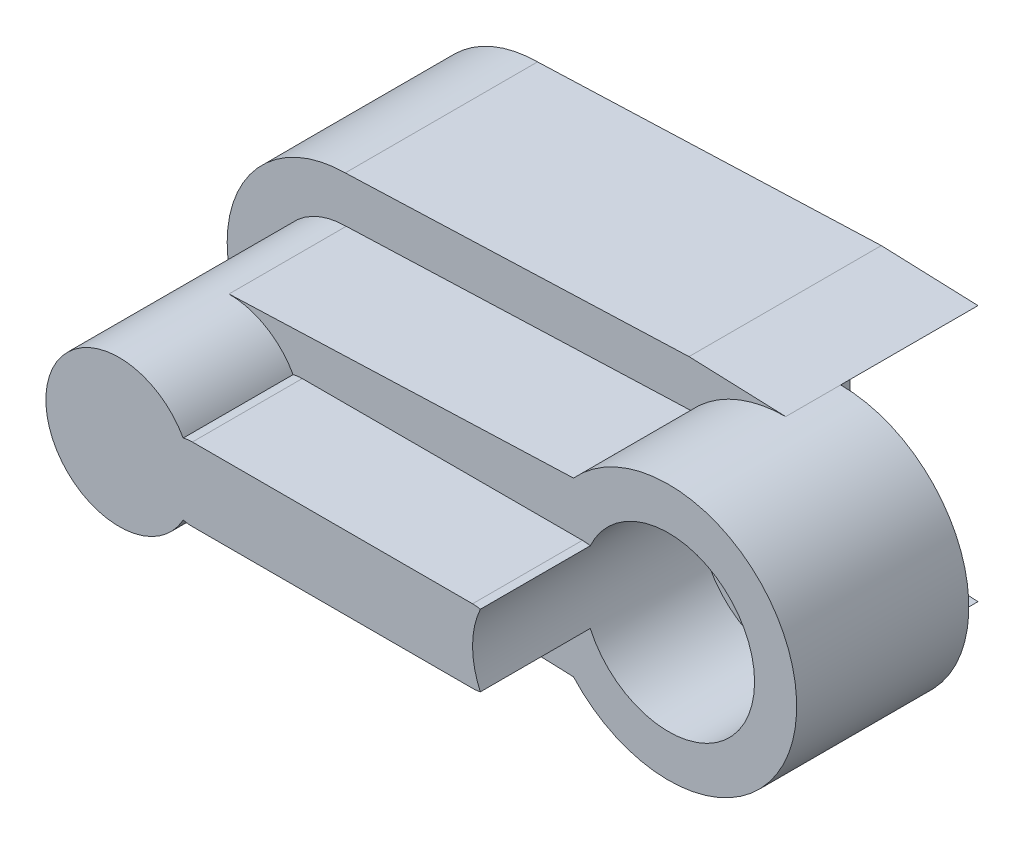
ISO-10303-21;
HEADER;
FILE_DESCRIPTION(('STEP AP214'),'2;1');
FILE_NAME('part.step','',(''),(''),'','','');
FILE_SCHEMA(('AUTOMOTIVE_DESIGN { 1 0 10303 214 1 1 1 1 }'));
ENDSEC;
DATA;
#1=APPLICATION_CONTEXT('core data for automotive mechanical design processes');
#2=APPLICATION_PROTOCOL_DEFINITION('international standard','automotive_design',2000,#1);
#3=PRODUCT_CONTEXT('',#1,'mechanical');
#4=PRODUCT('Part','Part','',(#3));
#5=PRODUCT_RELATED_PRODUCT_CATEGORY('part','',(#4));
#6=PRODUCT_DEFINITION_FORMATION('','',#4);
#7=PRODUCT_DEFINITION_CONTEXT('part definition',#1,'design');
#8=PRODUCT_DEFINITION('design','',#6,#7);
#9=PRODUCT_DEFINITION_SHAPE('','',#8);
#10=(LENGTH_UNIT() NAMED_UNIT(*) SI_UNIT(.MILLI.,.METRE.));
#11=(NAMED_UNIT(*) PLANE_ANGLE_UNIT() SI_UNIT($,.RADIAN.));
#12=(NAMED_UNIT(*) SI_UNIT($,.STERADIAN.) SOLID_ANGLE_UNIT());
#13=UNCERTAINTY_MEASURE_WITH_UNIT(LENGTH_MEASURE(1.E-05),#10,'distance_accuracy_value','');
#14=(GEOMETRIC_REPRESENTATION_CONTEXT(3) GLOBAL_UNCERTAINTY_ASSIGNED_CONTEXT((#13)) GLOBAL_UNIT_ASSIGNED_CONTEXT((#10,
#11,#12)) REPRESENTATION_CONTEXT('',''));
#15=CARTESIAN_POINT('',(0.,0.,0.));
#16=DIRECTION('',(0.,0.,1.));
#17=DIRECTION('',(1.,0.,0.));
#18=AXIS2_PLACEMENT_3D('',#15,#16,#17);
#19=CARTESIAN_POINT('',(-10.9395179752261,0.,2.));
#20=DIRECTION('',(0.,0.,-1.));
#21=DIRECTION('',(-1.,0.,0.));
#22=AXIS2_PLACEMENT_3D('',#19,#20,#21);
#23=PLANE('',#22);
#24=CARTESIAN_POINT('',(1.06048202477386,0.,2.));
#25=DIRECTION('',(0.,0.,-1.));
#26=DIRECTION('',(-1.,0.,0.));
#27=AXIS2_PLACEMENT_3D('',#24,#25,#26);
#28=CIRCLE('',#27,3.5);
#29=CARTESIAN_POINT('',(-0.867701970224191,2.92097697379376,2.));
#30=VERTEX_POINT('',#29);
#31=CARTESIAN_POINT('',(1.06048202477389,3.5,2.));
#32=VERTEX_POINT('',#31);
#33=EDGE_CURVE('E260',#30,#32,#28,.T.);
#34=ORIENTED_EDGE('',*,*,#33,.T.);
#35=CARTESIAN_POINT('',(1.06048202477386,0.,2.));
#36=DIRECTION('',(0.,0.,-1.));
#37=DIRECTION('',(-1.,0.,0.));
#38=AXIS2_PLACEMENT_3D('',#35,#36,#37);
#39=CIRCLE('',#38,3.5);
#40=CARTESIAN_POINT('',(1.06048202477382,-3.5,2.));
#41=VERTEX_POINT('',#40);
#42=EDGE_CURVE('E328',#32,#41,#39,.T.);
#43=ORIENTED_EDGE('',*,*,#42,.T.);
#44=CARTESIAN_POINT('',(1.06048202477386,0.,2.));
#45=DIRECTION('',(0.,0.,-1.));
#46=DIRECTION('',(-1.,0.,0.));
#47=AXIS2_PLACEMENT_3D('',#44,#45,#46);
#48=CIRCLE('',#47,3.5);
#49=CARTESIAN_POINT('',(-0.867701970224192,-2.92097697379376,2.));
#50=VERTEX_POINT('',#49);
#51=EDGE_CURVE('E215',#41,#50,#48,.T.);
#52=ORIENTED_EDGE('',*,*,#51,.T.);
#53=DIRECTION('',(0.998709726836808,-0.0507826891917705,0.));
#54=VECTOR('',#53,1.);
#55=CARTESIAN_POINT('',(-0.150381373619152,-2.95745150481052,2.));
#56=LINE('',#55,#54);
#57=CARTESIAN_POINT('',(-13.2440324405478,-2.29166164150024,2.));
#58=VERTEX_POINT('',#57);
#59=EDGE_CURVE('E276',#58,#50,#56,.T.);
#60=ORIENTED_EDGE('',*,*,#59,.F.);
#61=CARTESIAN_POINT('',(-10.9395179752261,0.,2.));
#62=DIRECTION('',(0.,0.,-1.));
#63=DIRECTION('',(-1.,0.,0.));
#64=AXIS2_PLACEMENT_3D('',#61,#62,#63);
#65=CIRCLE('',#64,3.24999999999999);
#66=CARTESIAN_POINT('',(-13.2440324405476,2.29166164150025,2.));
#67=VERTEX_POINT('',#66);
#68=EDGE_CURVE('E67',#58,#67,#65,.T.);
#69=ORIENTED_EDGE('',*,*,#68,.T.);
#70=DIRECTION('',(0.998709726836808,0.0507826891917705,0.));
#71=VECTOR('',#70,1.);
#72=CARTESIAN_POINT('',(-0.150381373619152,2.95745150481052,2.));
#73=LINE('',#72,#71);
#74=EDGE_CURVE('E62',#67,#30,#73,.T.);
#75=ORIENTED_EDGE('',*,*,#74,.T.);
#76=EDGE_LOOP('',(#34,#43,#52,#60,#69,#75));
#77=FACE_BOUND('',#76,.T.);
#78=CARTESIAN_POINT('',(1.06048202477387,0.,2.));
#79=DIRECTION('',(0.,0.,-1.));
#80=DIRECTION('',(-1.,0.,0.));
#81=AXIS2_PLACEMENT_3D('',#78,#79,#80);
#82=CIRCLE('',#81,1.45);
#83=CARTESIAN_POINT('',(-0.389517975226135,0.,2.));
#84=VERTEX_POINT('',#83);
#85=EDGE_CURVE('E310',#84,#84,#82,.T.);
#86=ORIENTED_EDGE('',*,*,#85,.F.);
#87=EDGE_LOOP('',(#86));
#88=FACE_BOUND('',#87,.T.);
#89=ADVANCED_FACE('F45',(#77,#88),#23,.T.);
#90=CARTESIAN_POINT('',(-0.089440802020708,2.40372347859468,6.7));
#91=DIRECTION('',(-0.0371835405784303,0.999308453036425,0.));
#92=DIRECTION('',(-0.999308453036425,-0.0371835405784303,0.));
#93=AXIS2_PLACEMENT_3D('',#90,#91,#92);
#94=PLANE('',#93);
#95=DIRECTION('',(0.,0.,-1.));
#96=VECTOR('',#95,1.);
#97=CARTESIAN_POINT('',(-1.53326044509472,2.35000000000001,6.7));
#98=LINE('',#97,#96);
#99=CARTESIAN_POINT('',(-1.53326044509472,2.35000000000001,6.7));
#100=VERTEX_POINT('',#99);
#101=CARTESIAN_POINT('',(-1.53326044509472,2.35000000000001,3.5));
#102=VERTEX_POINT('',#101);
#103=EDGE_CURVE('E401',#100,#102,#98,.T.);
#104=ORIENTED_EDGE('',*,*,#103,.T.);
#105=DIRECTION('',(0.999308453036425,0.0371835405784326,0.));
#106=VECTOR('',#105,1.);
#107=CARTESIAN_POINT('',(-0.0894408020207136,2.40372347859468,3.5));
#108=LINE('',#107,#106);
#109=CARTESIAN_POINT('',(-10.9395179752261,1.99999999999993,3.5));
#110=VERTEX_POINT('',#109);
#111=EDGE_CURVE('E294',#110,#102,#108,.T.);
#112=ORIENTED_EDGE('',*,*,#111,.F.);
#113=DIRECTION('',(0.,0.,-1.));
#114=VECTOR('',#113,1.);
#115=CARTESIAN_POINT('',(-10.9395179752261,1.99999999999993,6.7));
#116=LINE('',#115,#114);
#117=CARTESIAN_POINT('',(-10.9395179752261,1.99999999999993,6.7));
#118=VERTEX_POINT('',#117);
#119=EDGE_CURVE('E49',#118,#110,#116,.T.);
#120=ORIENTED_EDGE('',*,*,#119,.F.);
#121=DIRECTION('',(0.999308453036425,0.0371835405784303,0.));
#122=VECTOR('',#121,1.);
#123=CARTESIAN_POINT('',(-0.089440802020708,2.40372347859468,6.7));
#124=LINE('',#123,#122);
#125=EDGE_CURVE('E391',#118,#100,#124,.T.);
#126=ORIENTED_EDGE('',*,*,#125,.T.);
#127=EDGE_LOOP('',(#104,#112,#120,#126));
#128=FACE_BOUND('',#127,.T.);
#129=ADVANCED_FACE('F47',(#128),#94,.T.);
#130=CARTESIAN_POINT('',(-10.9395179752261,0.,6.7));
#131=DIRECTION('',(0.,0.,-1.));
#132=DIRECTION('',(-1.,0.,0.));
#133=AXIS2_PLACEMENT_3D('',#130,#131,#132);
#134=CYLINDRICAL_SURFACE('',#133,2.);
#135=CARTESIAN_POINT('',(-10.9395179752261,0.,3.5));
#136=DIRECTION('',(0.,0.,-1.));
#137=DIRECTION('',(-1.,0.,0.));
#138=AXIS2_PLACEMENT_3D('',#135,#136,#137);
#139=CIRCLE('',#138,1.99999999999999);
#140=CARTESIAN_POINT('',(-10.9395179752261,-2.00000000000005,3.5));
#141=VERTEX_POINT('',#140);
#142=EDGE_CURVE('E297',#141,#110,#139,.T.);
#143=ORIENTED_EDGE('',*,*,#142,.F.);
#144=DIRECTION('',(0.,0.,-1.));
#145=VECTOR('',#144,1.);
#146=CARTESIAN_POINT('',(-10.9395179752261,-2.00000000000005,6.7));
#147=LINE('',#146,#145);
#148=CARTESIAN_POINT('',(-10.9395179752261,-2.00000000000005,6.7));
#149=VERTEX_POINT('',#148);
#150=EDGE_CURVE('E406',#149,#141,#147,.T.);
#151=ORIENTED_EDGE('',*,*,#150,.F.);
#152=CARTESIAN_POINT('',(-10.9395179752261,0.,6.7));
#153=DIRECTION('',(0.,0.,1.));
#154=DIRECTION('',(1.,0.,0.));
#155=AXIS2_PLACEMENT_3D('',#152,#153,#154);
#156=CIRCLE('',#155,2.);
#157=CARTESIAN_POINT('',(-9.18951797522613,-0.968245836551952,6.7));
#158=VERTEX_POINT('',#157);
#159=EDGE_CURVE('E11',#149,#158,#156,.T.);
#160=ORIENTED_EDGE('',*,*,#159,.T.);
#161=DIRECTION('',(0.,0.,-1.));
#162=VECTOR('',#161,1.);
#163=CARTESIAN_POINT('',(-9.18951797522613,-0.968245836551952,9.7));
#164=LINE('',#163,#162);
#165=CARTESIAN_POINT('',(-9.18951797522613,-0.968245836551952,9.7));
#166=VERTEX_POINT('',#165);
#167=EDGE_CURVE('E385',#166,#158,#164,.T.);
#168=ORIENTED_EDGE('',*,*,#167,.F.);
#169=CARTESIAN_POINT('',(-10.9395179752261,0.,9.7));
#170=DIRECTION('',(0.,0.,1.));
#171=DIRECTION('',(1.,0.,0.));
#172=AXIS2_PLACEMENT_3D('',#169,#170,#171);
#173=CIRCLE('',#172,2.);
#174=CARTESIAN_POINT('',(-9.18951797522623,0.968245836551927,9.7));
#175=VERTEX_POINT('',#174);
#176=EDGE_CURVE('E335',#175,#166,#173,.T.);
#177=ORIENTED_EDGE('',*,*,#176,.F.);
#178=DIRECTION('',(0.,0.,-1.));
#179=VECTOR('',#178,1.);
#180=CARTESIAN_POINT('',(-9.18951797522623,0.968245836551927,9.7));
#181=LINE('',#180,#179);
#182=CARTESIAN_POINT('',(-9.18951797522623,0.968245836551927,6.7));
#183=VERTEX_POINT('',#182);
#184=EDGE_CURVE('E388',#175,#183,#181,.T.);
#185=ORIENTED_EDGE('',*,*,#184,.T.);
#186=EDGE_CURVE('E55',#183,#118,#156,.T.);
#187=ORIENTED_EDGE('',*,*,#186,.T.);
#188=ORIENTED_EDGE('',*,*,#119,.T.);
#189=EDGE_LOOP('',(#143,#151,#160,#168,#177,#185,#187,#188));
#190=FACE_BOUND('',#189,.T.);
#191=ADVANCED_FACE('F415',(#190),#134,.T.);
#192=CARTESIAN_POINT('',(-0.0894408020206935,-2.40372347859467,6.7));
#193=DIRECTION('',(0.0371835405784244,0.999308453036425,0.));
#194=DIRECTION('',(-0.999308453036425,0.0371835405784244,0.));
#195=AXIS2_PLACEMENT_3D('',#192,#193,#194);
#196=PLANE('',#195);
#197=DIRECTION('',(-0.999308453036425,0.0371835405784195,0.));
#198=VECTOR('',#197,1.);
#199=CARTESIAN_POINT('',(-0.0894408020206816,-2.40372347859467,3.5));
#200=LINE('',#199,#198);
#201=CARTESIAN_POINT('',(-1.53326044509472,-2.35000000000001,3.5));
#202=VERTEX_POINT('',#201);
#203=EDGE_CURVE('E299',#202,#141,#200,.T.);
#204=ORIENTED_EDGE('',*,*,#203,.F.);
#205=DIRECTION('',(0.,0.,-1.));
#206=VECTOR('',#205,1.);
#207=CARTESIAN_POINT('',(-1.53326044509472,-2.35000000000001,6.7));
#208=LINE('',#207,#206);
#209=CARTESIAN_POINT('',(-1.53326044509472,-2.35000000000001,6.7));
#210=VERTEX_POINT('',#209);
#211=EDGE_CURVE('E404',#210,#202,#208,.T.);
#212=ORIENTED_EDGE('',*,*,#211,.F.);
#213=DIRECTION('',(0.999308453036425,-0.0371835405784244,0.));
#214=VECTOR('',#213,1.);
#215=CARTESIAN_POINT('',(-0.0894408020206935,-2.40372347859467,6.7));
#216=LINE('',#215,#214);
#217=EDGE_CURVE('E394',#149,#210,#216,.T.);
#218=ORIENTED_EDGE('',*,*,#217,.F.);
#219=ORIENTED_EDGE('',*,*,#150,.T.);
#220=EDGE_LOOP('',(#204,#212,#218,#219));
#221=FACE_BOUND('',#220,.T.);
#222=ADVANCED_FACE('F448',(#221),#196,.F.);
#223=CARTESIAN_POINT('',(1.06048202477386,0.,6.7));
#224=DIRECTION('',(0.,0.,-1.));
#225=DIRECTION('',(-1.,0.,0.));
#226=AXIS2_PLACEMENT_3D('',#223,#224,#225);
#227=CYLINDRICAL_SURFACE('',#226,3.5);
#228=ORIENTED_EDGE('',*,*,#42,.F.);
#229=DIRECTION('',(0.,0.,-1.));
#230=VECTOR('',#229,1.);
#231=CARTESIAN_POINT('',(1.06048202477389,3.5,3.5));
#232=LINE('',#231,#230);
#233=CARTESIAN_POINT('',(1.06048202477389,3.5,3.5));
#234=VERTEX_POINT('',#233);
#235=EDGE_CURVE('E314',#234,#32,#232,.T.);
#236=ORIENTED_EDGE('',*,*,#235,.F.);
#237=CARTESIAN_POINT('',(1.06048202477386,0.,3.5));
#238=DIRECTION('',(0.,0.,-1.));
#239=DIRECTION('',(-1.,0.,0.));
#240=AXIS2_PLACEMENT_3D('',#237,#238,#239);
#241=CIRCLE('',#240,3.5);
#242=EDGE_CURVE('E292',#102,#234,#241,.T.);
#243=ORIENTED_EDGE('',*,*,#242,.F.);
#244=ORIENTED_EDGE('',*,*,#103,.F.);
#245=CARTESIAN_POINT('',(1.06048202477386,0.,6.7));
#246=DIRECTION('',(0.,0.,1.));
#247=DIRECTION('',(1.,0.,0.));
#248=AXIS2_PLACEMENT_3D('',#245,#246,#247);
#249=CIRCLE('',#248,3.5);
#250=EDGE_CURVE('E396',#210,#100,#249,.T.);
#251=ORIENTED_EDGE('',*,*,#250,.F.);
#252=ORIENTED_EDGE('',*,*,#211,.T.);
#253=CARTESIAN_POINT('',(1.06048202477382,-3.5,3.5));
#254=VERTEX_POINT('',#253);
#255=EDGE_CURVE('E295',#254,#202,#241,.T.);
#256=ORIENTED_EDGE('',*,*,#255,.F.);
#257=DIRECTION('',(0.,0.,-1.));
#258=VECTOR('',#257,1.);
#259=CARTESIAN_POINT('',(1.06048202477382,-3.5,3.5));
#260=LINE('',#259,#258);
#261=EDGE_CURVE('E312',#254,#41,#260,.T.);
#262=ORIENTED_EDGE('',*,*,#261,.T.);
#263=EDGE_LOOP('',(#228,#236,#243,#244,#251,#252,#256,#262));
#264=FACE_BOUND('',#263,.T.);
#265=ADVANCED_FACE('F427',(#264),#227,.T.);
#266=CARTESIAN_POINT('',(1.06048202477386,0.,6.7));
#267=DIRECTION('',(0.,0.,-1.));
#268=DIRECTION('',(-1.,0.,0.));
#269=AXIS2_PLACEMENT_3D('',#266,#267,#268);
#270=CYLINDRICAL_SURFACE('',#269,2.35);
#271=CARTESIAN_POINT('',(1.06048202477386,0.,6.7));
#272=DIRECTION('',(0.,0.,1.));
#273=DIRECTION('',(1.,0.,0.));
#274=AXIS2_PLACEMENT_3D('',#271,#272,#273);
#275=CIRCLE('',#274,2.35);
#276=CARTESIAN_POINT('',(-1.07675201777933,-0.977103191762131,6.7));
#277=VERTEX_POINT('',#276);
#278=CARTESIAN_POINT('',(-1.07675201777933,0.977103191762131,6.7));
#279=VERTEX_POINT('',#278);
#280=EDGE_CURVE('E398',#277,#279,#275,.T.);
#281=ORIENTED_EDGE('',*,*,#280,.T.);
#282=DIRECTION('',(0.,0.,-1.));
#283=VECTOR('',#282,1.);
#284=CARTESIAN_POINT('',(-1.07675201777933,0.977103191762131,9.7));
#285=LINE('',#284,#283);
#286=CARTESIAN_POINT('',(-1.07675201777933,0.977103191762131,9.7));
#287=VERTEX_POINT('',#286);
#288=EDGE_CURVE('E373',#287,#279,#285,.T.);
#289=ORIENTED_EDGE('',*,*,#288,.F.);
#290=CARTESIAN_POINT('',(1.06048202477386,0.,9.7));
#291=DIRECTION('',(0.,0.,-1.));
#292=DIRECTION('',(1.,0.,0.));
#293=AXIS2_PLACEMENT_3D('',#290,#291,#292);
#294=CIRCLE('',#293,2.35);
#295=CARTESIAN_POINT('',(-1.07675201777933,-0.977103191762131,9.7));
#296=VERTEX_POINT('',#295);
#297=EDGE_CURVE('E344',#296,#287,#294,.T.);
#298=ORIENTED_EDGE('',*,*,#297,.F.);
#299=DIRECTION('',(0.,0.,-1.));
#300=VECTOR('',#299,1.);
#301=CARTESIAN_POINT('',(-1.07675201777933,-0.977103191762131,9.7));
#302=LINE('',#301,#300);
#303=EDGE_CURVE('E376',#296,#277,#302,.T.);
#304=ORIENTED_EDGE('',*,*,#303,.T.);
#305=EDGE_LOOP('',(#281,#289,#298,#304));
#306=FACE_BOUND('',#305,.T.);
#307=CARTESIAN_POINT('',(1.06048202477387,0.,3.5));
#308=DIRECTION('',(0.,0.,-1.));
#309=DIRECTION('',(-1.,0.,0.));
#310=AXIS2_PLACEMENT_3D('',#307,#308,#309);
#311=CIRCLE('',#310,2.35);
#312=CARTESIAN_POINT('',(-1.28951797522614,0.,3.5));
#313=VERTEX_POINT('',#312);
#314=EDGE_CURVE('E323',#313,#313,#311,.T.);
#315=ORIENTED_EDGE('',*,*,#314,.T.);
#316=EDGE_LOOP('',(#315));
#317=FACE_BOUND('',#316,.T.);
#318=ADVANCED_FACE('F456',(#306,#317),#270,.F.);
#319=CARTESIAN_POINT('',(0.,0.,6.7));
#320=DIRECTION('',(0.,0.,1.));
#321=DIRECTION('',(1.,0.,0.));
#322=AXIS2_PLACEMENT_3D('',#319,#320,#321);
#323=PLANE('',#322);
#324=CARTESIAN_POINT('',(-1.28951797522614,0.,6.7));
#325=DIRECTION('',(0.,0.,1.));
#326=DIRECTION('',(1.,0.,0.));
#327=AXIS2_PLACEMENT_3D('',#324,#325,#326);
#328=CIRCLE('',#327,1.);
#329=CARTESIAN_POINT('',(-1.28951797522614,1.,6.7));
#330=VERTEX_POINT('',#329);
#331=EDGE_CURVE('E363',#279,#330,#328,.T.);
#332=ORIENTED_EDGE('',*,*,#331,.F.);
#333=ORIENTED_EDGE('',*,*,#280,.F.);
#334=CARTESIAN_POINT('',(-1.28951797522614,0.,6.7));
#335=DIRECTION('',(0.,0.,1.));
#336=DIRECTION('',(1.,0.,0.));
#337=AXIS2_PLACEMENT_3D('',#334,#335,#336);
#338=CIRCLE('',#337,1.);
#339=CARTESIAN_POINT('',(-1.28951797522614,-1.,6.7));
#340=VERTEX_POINT('',#339);
#341=EDGE_CURVE('E360',#340,#277,#338,.T.);
#342=ORIENTED_EDGE('',*,*,#341,.F.);
#343=DIRECTION('',(1.,0.,0.));
#344=VECTOR('',#343,1.);
#345=CARTESIAN_POINT('',(-8.93951797522613,-1.,6.7));
#346=LINE('',#345,#344);
#347=CARTESIAN_POINT('',(-8.93951797522613,-1.00000000000005,6.7));
#348=VERTEX_POINT('',#347);
#349=EDGE_CURVE('E357',#348,#340,#346,.T.);
#350=ORIENTED_EDGE('',*,*,#349,.F.);
#351=CARTESIAN_POINT('',(-8.93951797522613,0.,6.7));
#352=DIRECTION('',(0.,0.,1.));
#353=DIRECTION('',(1.,0.,0.));
#354=AXIS2_PLACEMENT_3D('',#351,#352,#353);
#355=CIRCLE('',#354,0.999999999999952);
#356=EDGE_CURVE('E354',#158,#348,#355,.T.);
#357=ORIENTED_EDGE('',*,*,#356,.F.);
#358=ORIENTED_EDGE('',*,*,#159,.F.);
#359=ORIENTED_EDGE('',*,*,#217,.T.);
#360=ORIENTED_EDGE('',*,*,#250,.T.);
#361=ORIENTED_EDGE('',*,*,#125,.F.);
#362=ORIENTED_EDGE('',*,*,#186,.F.);
#363=CARTESIAN_POINT('',(-8.93951797522613,0.,6.7));
#364=DIRECTION('',(0.,0.,1.));
#365=DIRECTION('',(1.,0.,0.));
#366=AXIS2_PLACEMENT_3D('',#363,#364,#365);
#367=CIRCLE('',#366,1.00000000000014);
#368=CARTESIAN_POINT('',(-8.93951797522613,1.,6.7));
#369=VERTEX_POINT('',#368);
#370=EDGE_CURVE('E331',#369,#183,#367,.T.);
#371=ORIENTED_EDGE('',*,*,#370,.F.);
#372=DIRECTION('',(-1.,0.,0.));
#373=VECTOR('',#372,1.);
#374=CARTESIAN_POINT('',(-8.93951797522613,1.,6.7));
#375=LINE('',#374,#373);
#376=EDGE_CURVE('E336',#330,#369,#375,.T.);
#377=ORIENTED_EDGE('',*,*,#376,.F.);
#378=EDGE_LOOP('',(#332,#333,#342,#350,#357,#358,#359,#360,#361,#362,#371,#377));
#379=FACE_BOUND('',#378,.T.);
#380=ADVANCED_FACE('F420',(#379),#323,.T.);
#381=CARTESIAN_POINT('',(-8.93951797522613,0.,9.7));
#382=DIRECTION('',(0.,0.,-1.));
#383=DIRECTION('',(-1.,0.,0.));
#384=AXIS2_PLACEMENT_3D('',#381,#382,#383);
#385=CYLINDRICAL_SURFACE('',#384,1.00000000000014);
#386=ORIENTED_EDGE('',*,*,#370,.T.);
#387=ORIENTED_EDGE('',*,*,#184,.F.);
#388=CARTESIAN_POINT('',(-8.93951797522613,0.,9.7));
#389=DIRECTION('',(0.,0.,1.));
#390=DIRECTION('',(1.,0.,0.));
#391=AXIS2_PLACEMENT_3D('',#388,#389,#390);
#392=CIRCLE('',#391,1.00000000000014);
#393=CARTESIAN_POINT('',(-8.93951797522613,1.,9.7));
#394=VERTEX_POINT('',#393);
#395=EDGE_CURVE('E332',#394,#175,#392,.T.);
#396=ORIENTED_EDGE('',*,*,#395,.F.);
#397=DIRECTION('',(0.,0.,-1.));
#398=VECTOR('',#397,1.);
#399=CARTESIAN_POINT('',(-8.93951797522613,1.,9.7));
#400=LINE('',#399,#398);
#401=EDGE_CURVE('E350',#394,#369,#400,.T.);
#402=ORIENTED_EDGE('',*,*,#401,.T.);
#403=EDGE_LOOP('',(#386,#387,#396,#402));
#404=FACE_BOUND('',#403,.T.);
#405=ADVANCED_FACE('F493',(#404),#385,.T.);
#406=CARTESIAN_POINT('',(-8.93951797522613,0.,9.7));
#407=DIRECTION('',(0.,0.,-1.));
#408=DIRECTION('',(-1.,0.,0.));
#409=AXIS2_PLACEMENT_3D('',#406,#407,#408);
#410=CYLINDRICAL_SURFACE('',#409,0.999999999999952);
#411=ORIENTED_EDGE('',*,*,#356,.T.);
#412=DIRECTION('',(0.,0.,-1.));
#413=VECTOR('',#412,1.);
#414=CARTESIAN_POINT('',(-8.93951797522613,-1.00000000000005,9.7));
#415=LINE('',#414,#413);
#416=CARTESIAN_POINT('',(-8.93951797522613,-1.00000000000005,9.7));
#417=VERTEX_POINT('',#416);
#418=EDGE_CURVE('E382',#417,#348,#415,.T.);
#419=ORIENTED_EDGE('',*,*,#418,.F.);
#420=CARTESIAN_POINT('',(-8.93951797522613,0.,9.7));
#421=DIRECTION('',(0.,0.,1.));
#422=DIRECTION('',(1.,0.,0.));
#423=AXIS2_PLACEMENT_3D('',#420,#421,#422);
#424=CIRCLE('',#423,0.999999999999952);
#425=EDGE_CURVE('E338',#166,#417,#424,.T.);
#426=ORIENTED_EDGE('',*,*,#425,.F.);
#427=ORIENTED_EDGE('',*,*,#167,.T.);
#428=EDGE_LOOP('',(#411,#419,#426,#427));
#429=FACE_BOUND('',#428,.T.);
#430=ADVANCED_FACE('F489',(#429),#410,.T.);
#431=CARTESIAN_POINT('',(-8.93951797522613,-1.,9.7));
#432=DIRECTION('',(0.,1.,0.));
#433=DIRECTION('',(0.,0.,1.));
#434=AXIS2_PLACEMENT_3D('',#431,#432,#433);
#435=PLANE('',#434);
#436=ORIENTED_EDGE('',*,*,#349,.T.);
#437=DIRECTION('',(0.,0.,-1.));
#438=VECTOR('',#437,1.);
#439=CARTESIAN_POINT('',(-1.28951797522614,-1.,9.7));
#440=LINE('',#439,#438);
#441=CARTESIAN_POINT('',(-1.28951797522614,-1.,9.7));
#442=VERTEX_POINT('',#441);
#443=EDGE_CURVE('E379',#442,#340,#440,.T.);
#444=ORIENTED_EDGE('',*,*,#443,.F.);
#445=DIRECTION('',(1.,0.,0.));
#446=VECTOR('',#445,1.);
#447=CARTESIAN_POINT('',(-8.93951797522613,-1.,9.7));
#448=LINE('',#447,#446);
#449=EDGE_CURVE('E340',#417,#442,#448,.T.);
#450=ORIENTED_EDGE('',*,*,#449,.F.);
#451=ORIENTED_EDGE('',*,*,#418,.T.);
#452=EDGE_LOOP('',(#436,#444,#450,#451));
#453=FACE_BOUND('',#452,.T.);
#454=ADVANCED_FACE('F485',(#453),#435,.F.);
#455=CARTESIAN_POINT('',(-1.28951797522614,0.,9.7));
#456=DIRECTION('',(0.,0.,-1.));
#457=DIRECTION('',(-1.,0.,0.));
#458=AXIS2_PLACEMENT_3D('',#455,#456,#457);
#459=CYLINDRICAL_SURFACE('',#458,1.);
#460=ORIENTED_EDGE('',*,*,#341,.T.);
#461=ORIENTED_EDGE('',*,*,#303,.F.);
#462=CARTESIAN_POINT('',(-1.28951797522614,0.,9.7));
#463=DIRECTION('',(0.,0.,1.));
#464=DIRECTION('',(1.,0.,0.));
#465=AXIS2_PLACEMENT_3D('',#462,#463,#464);
#466=CIRCLE('',#465,1.);
#467=EDGE_CURVE('E342',#442,#296,#466,.T.);
#468=ORIENTED_EDGE('',*,*,#467,.F.);
#469=ORIENTED_EDGE('',*,*,#443,.T.);
#470=EDGE_LOOP('',(#460,#461,#468,#469));
#471=FACE_BOUND('',#470,.T.);
#472=ADVANCED_FACE('F481',(#471),#459,.T.);
#473=CARTESIAN_POINT('',(-1.28951797522614,0.,9.7));
#474=DIRECTION('',(0.,0.,-1.));
#475=DIRECTION('',(-1.,0.,0.));
#476=AXIS2_PLACEMENT_3D('',#473,#474,#475);
#477=CYLINDRICAL_SURFACE('',#476,1.);
#478=ORIENTED_EDGE('',*,*,#331,.T.);
#479=DIRECTION('',(0.,0.,-1.));
#480=VECTOR('',#479,1.);
#481=CARTESIAN_POINT('',(-1.28951797522614,1.,9.7));
#482=LINE('',#481,#480);
#483=CARTESIAN_POINT('',(-1.28951797522614,1.,9.7));
#484=VERTEX_POINT('',#483);
#485=EDGE_CURVE('E370',#484,#330,#482,.T.);
#486=ORIENTED_EDGE('',*,*,#485,.F.);
#487=CARTESIAN_POINT('',(-1.28951797522614,0.,9.7));
#488=DIRECTION('',(0.,0.,1.));
#489=DIRECTION('',(1.,0.,0.));
#490=AXIS2_PLACEMENT_3D('',#487,#488,#489);
#491=CIRCLE('',#490,1.);
#492=EDGE_CURVE('E346',#287,#484,#491,.T.);
#493=ORIENTED_EDGE('',*,*,#492,.F.);
#494=ORIENTED_EDGE('',*,*,#288,.T.);
#495=EDGE_LOOP('',(#478,#486,#493,#494));
#496=FACE_BOUND('',#495,.T.);
#497=ADVANCED_FACE('F477',(#496),#477,.T.);
#498=CARTESIAN_POINT('',(-8.93951797522613,1.,9.7));
#499=DIRECTION('',(0.,-1.,0.));
#500=DIRECTION('',(0.,0.,-1.));
#501=AXIS2_PLACEMENT_3D('',#498,#499,#500);
#502=PLANE('',#501);
#503=ORIENTED_EDGE('',*,*,#376,.T.);
#504=ORIENTED_EDGE('',*,*,#401,.F.);
#505=DIRECTION('',(-1.,0.,0.));
#506=VECTOR('',#505,1.);
#507=CARTESIAN_POINT('',(-8.93951797522613,1.,9.7));
#508=LINE('',#507,#506);
#509=EDGE_CURVE('E348',#484,#394,#508,.T.);
#510=ORIENTED_EDGE('',*,*,#509,.F.);
#511=ORIENTED_EDGE('',*,*,#485,.T.);
#512=EDGE_LOOP('',(#503,#504,#510,#511));
#513=FACE_BOUND('',#512,.T.);
#514=ADVANCED_FACE('F473',(#513),#502,.F.);
#515=CARTESIAN_POINT('',(-8.93951797522613,0.,9.7));
#516=DIRECTION('',(0.,0.,1.));
#517=DIRECTION('',(1.,0.,0.));
#518=AXIS2_PLACEMENT_3D('',#515,#516,#517);
#519=PLANE('',#518);
#520=ORIENTED_EDGE('',*,*,#395,.T.);
#521=ORIENTED_EDGE('',*,*,#176,.T.);
#522=ORIENTED_EDGE('',*,*,#425,.T.);
#523=ORIENTED_EDGE('',*,*,#449,.T.);
#524=ORIENTED_EDGE('',*,*,#467,.T.);
#525=ORIENTED_EDGE('',*,*,#297,.T.);
#526=ORIENTED_EDGE('',*,*,#492,.T.);
#527=ORIENTED_EDGE('',*,*,#509,.T.);
#528=EDGE_LOOP('',(#520,#521,#522,#523,#524,#525,#526,#527));
#529=FACE_BOUND('',#528,.T.);
#530=ADVANCED_FACE('F470',(#529),#519,.T.);
#531=CARTESIAN_POINT('',(1.06048202477387,0.,3.5));
#532=DIRECTION('',(0.,0.,-1.));
#533=DIRECTION('',(-1.,0.,0.));
#534=AXIS2_PLACEMENT_3D('',#531,#532,#533);
#535=PLANE('',#534);
#536=CARTESIAN_POINT('',(1.06048202477387,0.,3.5));
#537=DIRECTION('',(0.,0.,-1.));
#538=DIRECTION('',(-1.,0.,0.));
#539=AXIS2_PLACEMENT_3D('',#536,#537,#538);
#540=CIRCLE('',#539,1.45);
#541=CARTESIAN_POINT('',(-0.389517975226135,0.,3.5));
#542=VERTEX_POINT('',#541);
#543=EDGE_CURVE('E320',#542,#542,#540,.T.);
#544=ORIENTED_EDGE('',*,*,#543,.T.);
#545=EDGE_LOOP('',(#544));
#546=FACE_BOUND('',#545,.T.);
#547=ORIENTED_EDGE('',*,*,#314,.F.);
#548=EDGE_LOOP('',(#547));
#549=FACE_BOUND('',#548,.T.);
#550=ADVANCED_FACE('F468',(#546,#549),#535,.F.);
#551=CARTESIAN_POINT('',(1.06048202477387,0.,3.5));
#552=DIRECTION('',(0.,0.,-1.));
#553=DIRECTION('',(-1.,0.,0.));
#554=AXIS2_PLACEMENT_3D('',#551,#552,#553);
#555=CYLINDRICAL_SURFACE('',#554,1.45);
#556=ORIENTED_EDGE('',*,*,#543,.F.);
#557=EDGE_LOOP('',(#556));
#558=FACE_BOUND('',#557,.T.);
#559=ORIENTED_EDGE('',*,*,#85,.T.);
#560=EDGE_LOOP('',(#559));
#561=FACE_BOUND('',#560,.T.);
#562=ADVANCED_FACE('F511',(#558,#561),#555,.F.);
#563=CARTESIAN_POINT('',(-10.9395179752261,0.,3.5));
#564=DIRECTION('',(0.,0.,-1.));
#565=DIRECTION('',(-1.,0.,0.));
#566=AXIS2_PLACEMENT_3D('',#563,#564,#565);
#567=CYLINDRICAL_SURFACE('',#566,3.24999999999999);
#568=ORIENTED_EDGE('',*,*,#68,.F.);
#569=DIRECTION('',(0.,0.,1.));
#570=VECTOR('',#569,1.);
#571=CARTESIAN_POINT('',(-13.2440324405478,-2.29166164150024,0.25));
#572=LINE('',#571,#570);
#573=CARTESIAN_POINT('',(-13.2440324405478,-2.29166164150024,0.25));
#574=VERTEX_POINT('',#573);
#575=EDGE_CURVE('E218',#574,#58,#572,.T.);
#576=ORIENTED_EDGE('',*,*,#575,.F.);
#577=DIRECTION('',(0.,0.,1.));
#578=VECTOR('',#577,1.);
#579=CARTESIAN_POINT('',(-13.2440324405478,-2.29166164150024,-1.75));
#580=LINE('',#579,#578);
#581=CARTESIAN_POINT('',(-13.2440324405478,-2.29166164150024,-1.75));
#582=VERTEX_POINT('',#581);
#583=EDGE_CURVE('E257',#582,#574,#580,.T.);
#584=ORIENTED_EDGE('',*,*,#583,.F.);
#585=CARTESIAN_POINT('',(-10.9395179752261,0.,-1.75));
#586=DIRECTION('',(0.,0.,-1.));
#587=DIRECTION('',(-1.,0.,0.));
#588=AXIS2_PLACEMENT_3D('',#585,#586,#587);
#589=CIRCLE('',#588,3.24999999999999);
#590=CARTESIAN_POINT('',(-10.9655725114801,-3.24989556157443,-1.75));
#591=VERTEX_POINT('',#590);
#592=EDGE_CURVE('E242',#591,#582,#589,.T.);
#593=ORIENTED_EDGE('',*,*,#592,.F.);
#594=DIRECTION('',(0.,0.,-1.));
#595=VECTOR('',#594,1.);
#596=CARTESIAN_POINT('',(-10.9655725114801,-3.24989556157439,3.5));
#597=LINE('',#596,#595);
#598=CARTESIAN_POINT('',(-10.9655725114801,-3.24989556157439,3.5));
#599=VERTEX_POINT('',#598);
#600=EDGE_CURVE('E308',#599,#591,#597,.T.);
#601=ORIENTED_EDGE('',*,*,#600,.F.);
#602=CARTESIAN_POINT('',(-10.9395179752261,0.,3.5));
#603=DIRECTION('',(0.,0.,-1.));
#604=DIRECTION('',(-1.,0.,0.));
#605=AXIS2_PLACEMENT_3D('',#602,#603,#604);
#606=CIRCLE('',#605,3.24999999999999);
#607=CARTESIAN_POINT('',(-10.9655725114802,3.24989556157426,3.5));
#608=VERTEX_POINT('',#607);
#609=EDGE_CURVE('E283',#599,#608,#606,.T.);
#610=ORIENTED_EDGE('',*,*,#609,.T.);
#611=DIRECTION('',(0.,0.,-1.));
#612=VECTOR('',#611,1.);
#613=CARTESIAN_POINT('',(-10.9655725114802,3.24989556157426,3.5));
#614=LINE('',#613,#612);
#615=CARTESIAN_POINT('',(-10.9655725114802,3.24989556157426,-1.75));
#616=VERTEX_POINT('',#615);
#617=EDGE_CURVE('E306',#608,#616,#614,.T.);
#618=ORIENTED_EDGE('',*,*,#617,.T.);
#619=CARTESIAN_POINT('',(-10.9395179752261,0.,-1.75));
#620=DIRECTION('',(0.,0.,-1.));
#621=DIRECTION('',(-1.,0.,0.));
#622=AXIS2_PLACEMENT_3D('',#619,#620,#621);
#623=CIRCLE('',#622,3.25000000000001);
#624=CARTESIAN_POINT('',(-13.2440324405476,2.29166164150026,-1.75));
#625=VERTEX_POINT('',#624);
#626=EDGE_CURVE('E246',#625,#616,#623,.T.);
#627=ORIENTED_EDGE('',*,*,#626,.F.);
#628=DIRECTION('',(0.,0.,1.));
#629=VECTOR('',#628,1.);
#630=CARTESIAN_POINT('',(-13.2440324405476,2.29166164150026,-1.75));
#631=LINE('',#630,#629);
#632=CARTESIAN_POINT('',(-13.2440324405476,2.29166164150025,0.25));
#633=VERTEX_POINT('',#632);
#634=EDGE_CURVE('E252',#625,#633,#631,.T.);
#635=ORIENTED_EDGE('',*,*,#634,.T.);
#636=DIRECTION('',(0.,0.,1.));
#637=VECTOR('',#636,1.);
#638=CARTESIAN_POINT('',(-13.2440324405476,2.29166164150025,0.25));
#639=LINE('',#638,#637);
#640=EDGE_CURVE('E268',#633,#67,#639,.T.);
#641=ORIENTED_EDGE('',*,*,#640,.T.);
#642=EDGE_LOOP('',(#568,#576,#584,#593,#601,#610,#618,#627,#635,#641));
#643=FACE_BOUND('',#642,.T.);
#644=ADVANCED_FACE('F443',(#643),#567,.T.);
#645=CARTESIAN_POINT('',(-0.135920227743705,-3.65285904489019,3.5));
#646=DIRECTION('',(-0.0371835405784193,-0.999308453036425,0.));
#647=DIRECTION('',(0.999308453036425,-0.0371835405784193,0.));
#648=AXIS2_PLACEMENT_3D('',#645,#646,#647);
#649=PLANE('',#648);
#650=ORIENTED_EDGE('',*,*,#600,.T.);
#651=DIRECTION('',(-0.999308453036425,0.0371835405784157,0.));
#652=VECTOR('',#651,1.);
#653=CARTESIAN_POINT('',(-1.57973987081775,-3.59913556629554,-1.75));
#654=LINE('',#653,#652);
#655=CARTESIAN_POINT('',(-1.57973987081775,-3.59913556629554,-1.75));
#656=VERTEX_POINT('',#655);
#657=EDGE_CURVE('E228',#656,#591,#654,.T.);
#658=ORIENTED_EDGE('',*,*,#657,.F.);
#659=DIRECTION('',(0.,0.,-1.));
#660=VECTOR('',#659,1.);
#661=CARTESIAN_POINT('',(-1.57973987081775,-3.59913556629554,3.5));
#662=LINE('',#661,#660);
#663=CARTESIAN_POINT('',(-1.57973987081775,-3.59913556629554,3.5));
#664=VERTEX_POINT('',#663);
#665=EDGE_CURVE('E224',#664,#656,#662,.T.);
#666=ORIENTED_EDGE('',*,*,#665,.F.);
#667=DIRECTION('',(-0.999308453036425,0.0371835405784193,0.));
#668=VECTOR('',#667,1.);
#669=CARTESIAN_POINT('',(-0.135920227743705,-3.65285904489019,3.5));
#670=LINE('',#669,#668);
#671=EDGE_CURVE('E303',#664,#599,#670,.T.);
#672=ORIENTED_EDGE('',*,*,#671,.T.);
#673=EDGE_LOOP('',(#650,#658,#666,#672));
#674=FACE_BOUND('',#673,.T.);
#675=ADVANCED_FACE('F446',(#674),#649,.T.);
#676=CARTESIAN_POINT('',(0.132726693693718,-3.5348355379841,3.5));
#677=DIRECTION('',(-0.0375217538688066,0.999295811052267,0.));
#678=DIRECTION('',(-0.999295811052268,-0.0375217538688066,0.));
#679=AXIS2_PLACEMENT_3D('',#676,#677,#678);
#680=PLANE('',#679);
#681=ORIENTED_EDGE('',*,*,#665,.T.);
#682=DIRECTION('',(-0.999295811052267,-0.0375217538688067,0.));
#683=VECTOR('',#682,1.);
#684=CARTESIAN_POINT('',(1.06048202477382,-3.5,-1.75));
#685=LINE('',#684,#683);
#686=CARTESIAN_POINT('',(1.06048202477382,-3.5,-1.75));
#687=VERTEX_POINT('',#686);
#688=EDGE_CURVE('E221',#687,#656,#685,.T.);
#689=ORIENTED_EDGE('',*,*,#688,.F.);
#690=DIRECTION('',(0.,0.,1.));
#691=VECTOR('',#690,1.);
#692=CARTESIAN_POINT('',(1.06048202477382,-3.5,0.25));
#693=LINE('',#692,#691);
#694=EDGE_CURVE('E208',#687,#41,#693,.T.);
#695=ORIENTED_EDGE('',*,*,#694,.T.);
#696=ORIENTED_EDGE('',*,*,#261,.F.);
#697=DIRECTION('',(0.999295811052268,0.0375217538688066,0.));
#698=VECTOR('',#697,1.);
#699=CARTESIAN_POINT('',(0.132726693693718,-3.5348355379841,3.5));
#700=LINE('',#699,#698);
#701=EDGE_CURVE('E301',#664,#254,#700,.T.);
#702=ORIENTED_EDGE('',*,*,#701,.F.);
#703=EDGE_LOOP('',(#681,#689,#695,#696,#702));
#704=FACE_BOUND('',#703,.T.);
#705=ADVANCED_FACE('F222',(#704),#680,.F.);
#706=CARTESIAN_POINT('',(0.132726693693715,3.5348355379841,3.5));
#707=DIRECTION('',(0.0375217538688056,0.999295811052267,0.));
#708=DIRECTION('',(-0.999295811052268,0.0375217538688056,0.));
#709=AXIS2_PLACEMENT_3D('',#706,#707,#708);
#710=PLANE('',#709);
#711=ORIENTED_EDGE('',*,*,#235,.T.);
#712=DIRECTION('',(0.,0.,1.));
#713=VECTOR('',#712,1.);
#714=CARTESIAN_POINT('',(1.06048202477389,3.5,0.25));
#715=LINE('',#714,#713);
#716=CARTESIAN_POINT('',(1.06048202477389,3.5,-1.75));
#717=VERTEX_POINT('',#716);
#718=EDGE_CURVE('E264',#717,#32,#715,.T.);
#719=ORIENTED_EDGE('',*,*,#718,.F.);
#720=DIRECTION('',(0.999295811052267,-0.0375217538688055,0.));
#721=VECTOR('',#720,1.);
#722=CARTESIAN_POINT('',(-1.57973987081776,3.59913556629554,-1.75));
#723=LINE('',#722,#721);
#724=CARTESIAN_POINT('',(-1.57973987081776,3.59913556629554,-1.75));
#725=VERTEX_POINT('',#724);
#726=EDGE_CURVE('E234',#725,#717,#723,.T.);
#727=ORIENTED_EDGE('',*,*,#726,.F.);
#728=DIRECTION('',(0.,0.,-1.));
#729=VECTOR('',#728,1.);
#730=CARTESIAN_POINT('',(-1.57973987081776,3.59913556629554,3.5));
#731=LINE('',#730,#729);
#732=CARTESIAN_POINT('',(-1.57973987081776,3.59913556629554,3.5));
#733=VERTEX_POINT('',#732);
#734=EDGE_CURVE('E317',#733,#725,#731,.T.);
#735=ORIENTED_EDGE('',*,*,#734,.F.);
#736=DIRECTION('',(0.999295811052268,-0.0375217538688056,0.));
#737=VECTOR('',#736,1.);
#738=CARTESIAN_POINT('',(0.132726693693715,3.5348355379841,3.5));
#739=LINE('',#738,#737);
#740=EDGE_CURVE('E289',#733,#234,#739,.T.);
#741=ORIENTED_EDGE('',*,*,#740,.T.);
#742=EDGE_LOOP('',(#711,#719,#727,#735,#741));
#743=FACE_BOUND('',#742,.T.);
#744=ADVANCED_FACE('F435',(#743),#710,.T.);
#745=CARTESIAN_POINT('',(-0.135920227743754,3.65285904489021,3.5));
#746=DIRECTION('',(-0.0371835405784326,0.999308453036425,0.));
#747=DIRECTION('',(-0.999308453036425,-0.0371835405784326,0.));
#748=AXIS2_PLACEMENT_3D('',#745,#746,#747);
#749=PLANE('',#748);
#750=ORIENTED_EDGE('',*,*,#734,.T.);
#751=DIRECTION('',(0.999308453036425,0.0371835405784328,0.));
#752=VECTOR('',#751,1.);
#753=CARTESIAN_POINT('',(-10.9655725114802,3.24989556157426,-1.75));
#754=LINE('',#753,#752);
#755=EDGE_CURVE('E249',#616,#725,#754,.T.);
#756=ORIENTED_EDGE('',*,*,#755,.F.);
#757=ORIENTED_EDGE('',*,*,#617,.F.);
#758=DIRECTION('',(0.999308453036425,0.0371835405784326,0.));
#759=VECTOR('',#758,1.);
#760=CARTESIAN_POINT('',(-0.135920227743754,3.65285904489021,3.5));
#761=LINE('',#760,#759);
#762=EDGE_CURVE('E286',#608,#733,#761,.T.);
#763=ORIENTED_EDGE('',*,*,#762,.T.);
#764=EDGE_LOOP('',(#750,#756,#757,#763));
#765=FACE_BOUND('',#764,.T.);
#766=ADVANCED_FACE('F438',(#765),#749,.T.);
#767=CARTESIAN_POINT('',(0.,0.,3.5));
#768=DIRECTION('',(0.,0.,-1.));
#769=DIRECTION('',(-1.,0.,0.));
#770=AXIS2_PLACEMENT_3D('',#767,#768,#769);
#771=PLANE('',#770);
#772=ORIENTED_EDGE('',*,*,#609,.F.);
#773=ORIENTED_EDGE('',*,*,#671,.F.);
#774=ORIENTED_EDGE('',*,*,#701,.T.);
#775=ORIENTED_EDGE('',*,*,#255,.T.);
#776=ORIENTED_EDGE('',*,*,#203,.T.);
#777=ORIENTED_EDGE('',*,*,#142,.T.);
#778=ORIENTED_EDGE('',*,*,#111,.T.);
#779=ORIENTED_EDGE('',*,*,#242,.T.);
#780=ORIENTED_EDGE('',*,*,#740,.F.);
#781=ORIENTED_EDGE('',*,*,#762,.F.);
#782=EDGE_LOOP('',(#772,#773,#774,#775,#776,#777,#778,#779,#780,#781));
#783=FACE_BOUND('',#782,.T.);
#784=ADVANCED_FACE('F432',(#783),#771,.F.);
#785=CARTESIAN_POINT('',(1.06048202477386,0.,0.25));
#786=DIRECTION('',(0.,0.,1.));
#787=DIRECTION('',(1.,0.,0.));
#788=AXIS2_PLACEMENT_3D('',#785,#786,#787);
#789=CYLINDRICAL_SURFACE('',#788,3.5);
#790=ORIENTED_EDGE('',*,*,#51,.F.);
#791=ORIENTED_EDGE('',*,*,#694,.F.);
#792=CARTESIAN_POINT('',(1.06048202477383,0.,-1.75));
#793=DIRECTION('',(0.,0.,1.));
#794=DIRECTION('',(-1.,0.,0.));
#795=AXIS2_PLACEMENT_3D('',#792,#793,#794);
#796=CIRCLE('',#795,3.5);
#797=EDGE_CURVE('E213',#717,#687,#796,.T.);
#798=ORIENTED_EDGE('',*,*,#797,.F.);
#799=ORIENTED_EDGE('',*,*,#718,.T.);
#800=ORIENTED_EDGE('',*,*,#33,.F.);
#801=DIRECTION('',(0.,0.,1.));
#802=VECTOR('',#801,1.);
#803=CARTESIAN_POINT('',(-0.867701970224192,2.92097697379376,0.25));
#804=LINE('',#803,#802);
#805=CARTESIAN_POINT('',(-0.867701970224192,2.92097697379376,0.25));
#806=VERTEX_POINT('',#805);
#807=EDGE_CURVE('E270',#806,#30,#804,.T.);
#808=ORIENTED_EDGE('',*,*,#807,.F.);
#809=CARTESIAN_POINT('',(1.06048202477383,0.,0.25));
#810=DIRECTION('',(0.,0.,1.));
#811=DIRECTION('',(-1.,0.,0.));
#812=AXIS2_PLACEMENT_3D('',#809,#810,#811);
#813=CIRCLE('',#812,3.5);
#814=CARTESIAN_POINT('',(-0.867701970224192,-2.92097697379376,0.25));
#815=VERTEX_POINT('',#814);
#816=EDGE_CURVE('E238',#806,#815,#813,.T.);
#817=ORIENTED_EDGE('',*,*,#816,.T.);
#818=DIRECTION('',(0.,0.,1.));
#819=VECTOR('',#818,1.);
#820=CARTESIAN_POINT('',(-0.867701970224192,-2.92097697379376,0.25));
#821=LINE('',#820,#819);
#822=EDGE_CURVE('E275',#815,#50,#821,.T.);
#823=ORIENTED_EDGE('',*,*,#822,.T.);
#824=EDGE_LOOP('',(#790,#791,#798,#799,#800,#808,#817,#823));
#825=FACE_BOUND('',#824,.T.);
#826=ADVANCED_FACE('F210',(#825),#789,.F.);
#827=CARTESIAN_POINT('',(-0.150381373619152,-2.95745150481052,0.25));
#828=DIRECTION('',(-0.0507826891917706,-0.998709726836808,0.));
#829=DIRECTION('',(0.998709726836808,-0.0507826891917706,0.));
#830=AXIS2_PLACEMENT_3D('',#827,#828,#829);
#831=PLANE('',#830);
#832=ORIENTED_EDGE('',*,*,#59,.T.);
#833=ORIENTED_EDGE('',*,*,#822,.F.);
#834=DIRECTION('',(0.998709726836808,-0.0507826891917705,0.));
#835=VECTOR('',#834,1.);
#836=CARTESIAN_POINT('',(-0.150381373619152,-2.95745150481052,0.25));
#837=LINE('',#836,#835);
#838=EDGE_CURVE('E272',#574,#815,#837,.T.);
#839=ORIENTED_EDGE('',*,*,#838,.F.);
#840=ORIENTED_EDGE('',*,*,#575,.T.);
#841=EDGE_LOOP('',(#832,#833,#839,#840));
#842=FACE_BOUND('',#841,.T.);
#843=ADVANCED_FACE('F536',(#842),#831,.F.);
#844=CARTESIAN_POINT('',(-0.150381373619152,2.95745150481052,0.25));
#845=DIRECTION('',(0.0507826891917706,-0.998709726836808,0.));
#846=DIRECTION('',(0.998709726836808,0.0507826891917706,0.));
#847=AXIS2_PLACEMENT_3D('',#844,#845,#846);
#848=PLANE('',#847);
#849=ORIENTED_EDGE('',*,*,#74,.F.);
#850=ORIENTED_EDGE('',*,*,#640,.F.);
#851=DIRECTION('',(0.998709726836808,0.0507826891917705,0.));
#852=VECTOR('',#851,1.);
#853=CARTESIAN_POINT('',(-0.150381373619152,2.95745150481052,0.25));
#854=LINE('',#853,#852);
#855=EDGE_CURVE('E261',#633,#806,#854,.T.);
#856=ORIENTED_EDGE('',*,*,#855,.T.);
#857=ORIENTED_EDGE('',*,*,#807,.T.);
#858=EDGE_LOOP('',(#849,#850,#856,#857));
#859=FACE_BOUND('',#858,.T.);
#860=ADVANCED_FACE('F539',(#859),#848,.T.);
#861=CARTESIAN_POINT('',(1.06048202477383,0.,0.25));
#862=DIRECTION('',(0.,0.,-1.));
#863=DIRECTION('',(-1.,0.,0.));
#864=AXIS2_PLACEMENT_3D('',#861,#862,#863);
#865=PLANE('',#864);
#866=DIRECTION('',(0.,1.,0.));
#867=VECTOR('',#866,1.);
#868=CARTESIAN_POINT('',(-13.2440324405478,-2.29166164150024,0.25));
#869=LINE('',#868,#867);
#870=EDGE_CURVE('E235',#574,#633,#869,.T.);
#871=ORIENTED_EDGE('',*,*,#870,.F.);
#872=ORIENTED_EDGE('',*,*,#838,.T.);
#873=ORIENTED_EDGE('',*,*,#816,.F.);
#874=ORIENTED_EDGE('',*,*,#855,.F.);
#875=EDGE_LOOP('',(#871,#872,#873,#874));
#876=FACE_BOUND('',#875,.T.);
#877=ADVANCED_FACE('F543',(#876),#865,.F.);
#878=CARTESIAN_POINT('',(-13.2440324405478,-2.29166164150024,-1.75));
#879=DIRECTION('',(1.,0.,0.));
#880=DIRECTION('',(0.,1.,0.));
#881=AXIS2_PLACEMENT_3D('',#878,#879,#880);
#882=PLANE('',#881);
#883=ORIENTED_EDGE('',*,*,#870,.T.);
#884=ORIENTED_EDGE('',*,*,#634,.F.);
#885=DIRECTION('',(0.,1.,0.));
#886=VECTOR('',#885,1.);
#887=CARTESIAN_POINT('',(-13.2440324405478,-2.29166164150024,-1.75));
#888=LINE('',#887,#886);
#889=EDGE_CURVE('E244',#582,#625,#888,.T.);
#890=ORIENTED_EDGE('',*,*,#889,.F.);
#891=ORIENTED_EDGE('',*,*,#583,.T.);
#892=EDGE_LOOP('',(#883,#884,#890,#891));
#893=FACE_BOUND('',#892,.T.);
#894=ADVANCED_FACE('F545',(#893),#882,.F.);
#895=CARTESIAN_POINT('',(1.06048202477383,0.,-1.75));
#896=DIRECTION('',(0.,0.,-1.));
#897=DIRECTION('',(-1.,0.,0.));
#898=AXIS2_PLACEMENT_3D('',#895,#896,#897);
#899=PLANE('',#898);
#900=ORIENTED_EDGE('',*,*,#797,.T.);
#901=ORIENTED_EDGE('',*,*,#688,.T.);
#902=ORIENTED_EDGE('',*,*,#657,.T.);
#903=ORIENTED_EDGE('',*,*,#592,.T.);
#904=ORIENTED_EDGE('',*,*,#889,.T.);
#905=ORIENTED_EDGE('',*,*,#626,.T.);
#906=ORIENTED_EDGE('',*,*,#755,.T.);
#907=ORIENTED_EDGE('',*,*,#726,.T.);
#908=EDGE_LOOP('',(#900,#901,#902,#903,#904,#905,#906,#907));
#909=FACE_BOUND('',#908,.T.);
#910=ADVANCED_FACE('F231',(#909),#899,.T.);
#911=CLOSED_SHELL('',(#89,#129,#191,#222,#265,#318,#380,#405,#430,#454,#472,#497,#514,#530,#550,
#562,#644,#675,#705,#744,#766,#784,#826,#843,#860,#877,#894,#910));
#912=MANIFOLD_SOLID_BREP('B2',#911);
#913=ADVANCED_BREP_SHAPE_REPRESENTATION('',(#18,#912),#14);
#914=SHAPE_DEFINITION_REPRESENTATION(#9,#913);
ENDSEC;
END-ISO-10303-21;
